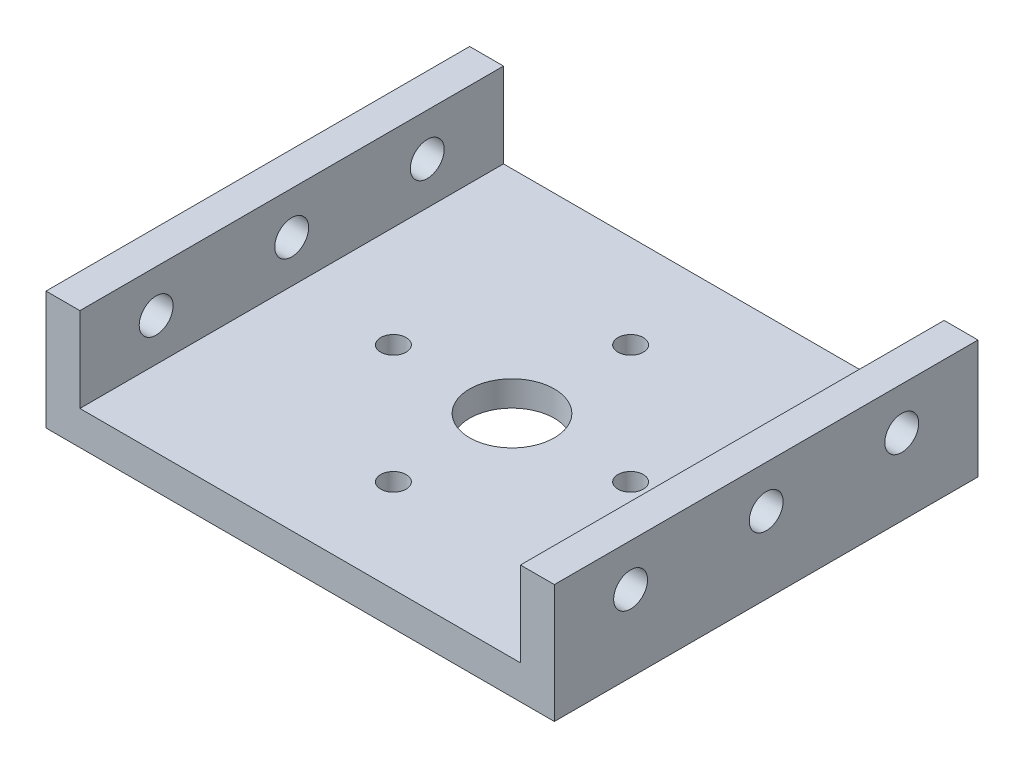
ISO-10303-21;
HEADER;
FILE_DESCRIPTION(('STEP AP214'),'2;1');
FILE_NAME('part.step','',(''),(''),'','','');
FILE_SCHEMA(('AUTOMOTIVE_DESIGN { 1 0 10303 214 1 1 1 1 }'));
ENDSEC;
DATA;
#1=APPLICATION_CONTEXT('core data for automotive mechanical design processes');
#2=APPLICATION_PROTOCOL_DEFINITION('international standard','automotive_design',2000,#1);
#3=PRODUCT_CONTEXT('',#1,'mechanical');
#4=PRODUCT('Part','Part','',(#3));
#5=PRODUCT_RELATED_PRODUCT_CATEGORY('part','',(#4));
#6=PRODUCT_DEFINITION_FORMATION('','',#4);
#7=PRODUCT_DEFINITION_CONTEXT('part definition',#1,'design');
#8=PRODUCT_DEFINITION('design','',#6,#7);
#9=PRODUCT_DEFINITION_SHAPE('','',#8);
#10=(LENGTH_UNIT() NAMED_UNIT(*) SI_UNIT(.MILLI.,.METRE.));
#11=(NAMED_UNIT(*) PLANE_ANGLE_UNIT() SI_UNIT($,.RADIAN.));
#12=(NAMED_UNIT(*) SI_UNIT($,.STERADIAN.) SOLID_ANGLE_UNIT());
#13=UNCERTAINTY_MEASURE_WITH_UNIT(LENGTH_MEASURE(1.E-05),#10,'distance_accuracy_value','');
#14=(GEOMETRIC_REPRESENTATION_CONTEXT(3) GLOBAL_UNCERTAINTY_ASSIGNED_CONTEXT((#13)) GLOBAL_UNIT_ASSIGNED_CONTEXT((#10,
#11,#12)) REPRESENTATION_CONTEXT('',''));
#15=CARTESIAN_POINT('',(0.,0.,0.));
#16=DIRECTION('',(0.,0.,1.));
#17=DIRECTION('',(1.,0.,0.));
#18=AXIS2_PLACEMENT_3D('',#15,#16,#17);
#19=CARTESIAN_POINT('',(0.,-14.142135623731,0.));
#20=DIRECTION('',(0.,1.,0.));
#21=DIRECTION('',(0.,0.,1.));
#22=AXIS2_PLACEMENT_3D('',#19,#20,#21);
#23=CYLINDRICAL_SURFACE('',#22,5.);
#24=CARTESIAN_POINT('',(0.,3.99999999999999,0.));
#25=DIRECTION('',(0.,1.,0.));
#26=DIRECTION('',(0.,0.,1.));
#27=AXIS2_PLACEMENT_3D('',#24,#25,#26);
#28=CIRCLE('',#27,5.);
#29=CARTESIAN_POINT('',(0.,3.99999999999999,5.));
#30=VERTEX_POINT('',#29);
#31=EDGE_CURVE('E149',#30,#30,#28,.T.);
#32=CARTESIAN_POINT('',(0.,0.999999999999999,0.));
#33=DIRECTION('',(0.,-1.,0.));
#34=DIRECTION('',(1.,0.,0.));
#35=AXIS2_PLACEMENT_3D('',#32,#33,#34);
#36=CIRCLE('',#35,5.);
#37=CARTESIAN_POINT('',(0.,1.,5.));
#38=VERTEX_POINT('',#37);
#39=EDGE_CURVE('E510',#38,#38,#36,.F.);
#40=CARTESIAN_POINT('',(0.,3.99999999999999,5.));
#41=CARTESIAN_POINT('',(0.,3.96874999999999,5.));
#42=CARTESIAN_POINT('',(0.,3.93749999999999,5.));
#43=CARTESIAN_POINT('',(0.,3.87499999999999,5.));
#44=CARTESIAN_POINT('',(0.,3.84374999999999,5.));
#45=CARTESIAN_POINT('',(0.,3.78124999999999,5.));
#46=CARTESIAN_POINT('',(0.,3.74999999999999,5.));
#47=CARTESIAN_POINT('',(0.,3.68749999999999,5.));
#48=CARTESIAN_POINT('',(0.,3.65624999999999,5.));
#49=CARTESIAN_POINT('',(0.,3.59374999999999,5.));
#50=CARTESIAN_POINT('',(0.,3.56249999999999,5.));
#51=CARTESIAN_POINT('',(0.,3.49999999999999,5.));
#52=CARTESIAN_POINT('',(0.,3.46874999999999,5.));
#53=CARTESIAN_POINT('',(0.,3.40624999999999,5.));
#54=CARTESIAN_POINT('',(0.,3.37499999999999,5.));
#55=CARTESIAN_POINT('',(0.,3.31249999999999,5.));
#56=CARTESIAN_POINT('',(0.,3.28124999999999,5.));
#57=CARTESIAN_POINT('',(0.,3.21874999999999,5.));
#58=CARTESIAN_POINT('',(0.,3.18749999999999,5.));
#59=CARTESIAN_POINT('',(0.,3.12499999999999,5.));
#60=CARTESIAN_POINT('',(0.,3.09374999999999,5.));
#61=CARTESIAN_POINT('',(0.,3.03124999999999,5.));
#62=CARTESIAN_POINT('',(0.,2.99999999999999,5.));
#63=CARTESIAN_POINT('',(0.,2.93749999999999,5.));
#64=CARTESIAN_POINT('',(0.,2.90624999999999,5.));
#65=CARTESIAN_POINT('',(0.,2.84374999999999,5.));
#66=CARTESIAN_POINT('',(0.,2.81249999999999,5.));
#67=CARTESIAN_POINT('',(0.,2.74999999999999,5.));
#68=CARTESIAN_POINT('',(0.,2.71874999999999,5.));
#69=CARTESIAN_POINT('',(0.,2.65624999999999,5.));
#70=CARTESIAN_POINT('',(0.,2.62499999999999,5.));
#71=CARTESIAN_POINT('',(0.,2.5625,5.));
#72=CARTESIAN_POINT('',(0.,2.53125,5.));
#73=CARTESIAN_POINT('',(0.,2.46875,5.));
#74=CARTESIAN_POINT('',(0.,2.4375,5.));
#75=CARTESIAN_POINT('',(0.,2.375,5.));
#76=CARTESIAN_POINT('',(0.,2.34375,5.));
#77=CARTESIAN_POINT('',(0.,2.28125,5.));
#78=CARTESIAN_POINT('',(0.,2.25,5.));
#79=CARTESIAN_POINT('',(0.,2.1875,5.));
#80=CARTESIAN_POINT('',(0.,2.15625,5.));
#81=CARTESIAN_POINT('',(0.,2.09375,5.));
#82=CARTESIAN_POINT('',(0.,2.0625,5.));
#83=CARTESIAN_POINT('',(0.,2.,5.));
#84=CARTESIAN_POINT('',(0.,1.96875,5.));
#85=CARTESIAN_POINT('',(0.,1.90625,5.));
#86=CARTESIAN_POINT('',(0.,1.875,5.));
#87=CARTESIAN_POINT('',(0.,1.8125,5.));
#88=CARTESIAN_POINT('',(0.,1.78125,5.));
#89=CARTESIAN_POINT('',(0.,1.71875,5.));
#90=CARTESIAN_POINT('',(0.,1.6875,5.));
#91=CARTESIAN_POINT('',(0.,1.625,5.));
#92=CARTESIAN_POINT('',(0.,1.59375,5.));
#93=CARTESIAN_POINT('',(0.,1.53125,5.));
#94=CARTESIAN_POINT('',(0.,1.5,5.));
#95=CARTESIAN_POINT('',(0.,1.4375,5.));
#96=CARTESIAN_POINT('',(0.,1.40625,5.));
#97=CARTESIAN_POINT('',(0.,1.34375,5.));
#98=CARTESIAN_POINT('',(0.,1.3125,5.));
#99=CARTESIAN_POINT('',(0.,1.25,5.));
#100=CARTESIAN_POINT('',(0.,1.21875,5.));
#101=CARTESIAN_POINT('',(0.,1.15625,5.));
#102=CARTESIAN_POINT('',(0.,1.125,5.));
#103=CARTESIAN_POINT('',(0.,1.0625,5.));
#104=CARTESIAN_POINT('',(0.,1.03125,5.));
#105=CARTESIAN_POINT('',(0.,1.,5.));
#106=B_SPLINE_CURVE_WITH_KNOTS('',3,(#40,#41,#42,#43,#44,#45,#46,#47,#48,#49,#50,#51,#52,#53,
#54,#55,#56,#57,#58,#59,#60,#61,#62,#63,#64,#65,#66,#67,#68,#69,#70,#71,#72,#73,#74,#75,#76,#77,
#78,#79,#80,#81,#82,#83,#84,#85,#86,#87,#88,#89,#90,#91,#92,#93,#94,#95,#96,#97,#98,#99,#100,
#101,#102,#103,#104,#105),.UNSPECIFIED.,.F.,.F.,(4,2,2,2,2,2,2,2,2,2,2,2,2,2,2,2,2,2,2,2,2,2,2,
2,2,2,2,2,2,2,2,2,4),(0.,0.0937500000000001,0.1875,0.28125,0.375,0.46875,0.562499999999997,
0.656249999999997,0.749999999999997,0.843749999999997,0.937499999999997,1.03125,1.125,1.21875,
1.3125,1.40625,1.49999999999999,1.59374999999999,1.68749999999999,1.78124999999999,
1.87499999999999,1.96874999999999,2.06249999999999,2.15625,2.25,2.34375,2.4375,2.53124999999999,
2.62499999999999,2.71874999999999,2.81249999999999,2.90624999999999,2.99999999999999),.UNSPECIFIED.);
#107=EDGE_CURVE('BSEAM36',#30,#38,#106,.T.);
#108=ORIENTED_EDGE('',*,*,#31,.T.);
#109=ORIENTED_EDGE('',*,*,#39,.F.);
#110=ORIENTED_EDGE('',*,*,#107,.T.);
#111=ORIENTED_EDGE('',*,*,#107,.F.);
#112=EDGE_LOOP('',(#108,#110,#109,#111));
#113=FACE_BOUND('',#112,.T.);
#114=ADVANCED_FACE('F36',(#113),#23,.F.);
#115=CARTESIAN_POINT('',(30.,14.,25.));
#116=DIRECTION('',(0.,-1.,0.));
#117=DIRECTION('',(0.,0.,-1.));
#118=AXIS2_PLACEMENT_3D('',#115,#116,#117);
#119=PLANE('',#118);
#120=DIRECTION('',(-1.,0.,0.));
#121=VECTOR('',#120,1.);
#122=CARTESIAN_POINT('',(30.,14.,-25.));
#123=LINE('',#122,#121);
#124=CARTESIAN_POINT('',(30.,14.,-25.));
#125=VERTEX_POINT('',#124);
#126=CARTESIAN_POINT('',(26.,14.,-25.));
#127=VERTEX_POINT('',#126);
#128=EDGE_CURVE('E145',#125,#127,#123,.T.);
#129=ORIENTED_EDGE('',*,*,#128,.T.);
#130=DIRECTION('',(0.,0.,-1.));
#131=VECTOR('',#130,1.);
#132=CARTESIAN_POINT('',(26.,14.,25.));
#133=LINE('',#132,#131);
#134=CARTESIAN_POINT('',(26.,14.,25.));
#135=VERTEX_POINT('',#134);
#136=EDGE_CURVE('E174',#135,#127,#133,.T.);
#137=ORIENTED_EDGE('',*,*,#136,.F.);
#138=DIRECTION('',(-1.,0.,0.));
#139=VECTOR('',#138,1.);
#140=CARTESIAN_POINT('',(30.,14.,25.));
#141=LINE('',#140,#139);
#142=CARTESIAN_POINT('',(30.,14.,25.));
#143=VERTEX_POINT('',#142);
#144=EDGE_CURVE('E161',#143,#135,#141,.T.);
#145=ORIENTED_EDGE('',*,*,#144,.F.);
#146=DIRECTION('',(0.,0.,-1.));
#147=VECTOR('',#146,1.);
#148=CARTESIAN_POINT('',(30.,14.,25.));
#149=LINE('',#148,#147);
#150=EDGE_CURVE('E141',#143,#125,#149,.T.);
#151=ORIENTED_EDGE('',*,*,#150,.T.);
#152=EDGE_LOOP('',(#129,#137,#145,#151));
#153=FACE_BOUND('',#152,.T.);
#154=ADVANCED_FACE('F38',(#153),#119,.F.);
#155=CARTESIAN_POINT('',(26.,14.,25.));
#156=DIRECTION('',(1.,0.,0.));
#157=DIRECTION('',(0.,1.,0.));
#158=AXIS2_PLACEMENT_3D('',#155,#156,#157);
#159=PLANE('',#158);
#160=CARTESIAN_POINT('',(26.,9.00000000000001,16.));
#161=DIRECTION('',(1.,0.,0.));
#162=DIRECTION('',(0.,1.,0.));
#163=AXIS2_PLACEMENT_3D('',#160,#161,#162);
#164=CIRCLE('',#163,2.);
#165=CARTESIAN_POINT('',(26.,11.,16.));
#166=VERTEX_POINT('',#165);
#167=EDGE_CURVE('E483',#166,#166,#164,.T.);
#168=ORIENTED_EDGE('',*,*,#167,.T.);
#169=EDGE_LOOP('',(#168));
#170=FACE_BOUND('',#169,.T.);
#171=CARTESIAN_POINT('',(26.,9.,0.));
#172=DIRECTION('',(1.,0.,0.));
#173=DIRECTION('',(0.,1.,0.));
#174=AXIS2_PLACEMENT_3D('',#171,#172,#173);
#175=CIRCLE('',#174,2.);
#176=CARTESIAN_POINT('',(26.,11.,0.));
#177=VERTEX_POINT('',#176);
#178=EDGE_CURVE('E484',#177,#177,#175,.T.);
#179=ORIENTED_EDGE('',*,*,#178,.T.);
#180=EDGE_LOOP('',(#179));
#181=FACE_BOUND('',#180,.T.);
#182=CARTESIAN_POINT('',(26.,9.00000000000001,-16.));
#183=DIRECTION('',(1.,0.,0.));
#184=DIRECTION('',(0.,1.,0.));
#185=AXIS2_PLACEMENT_3D('',#182,#183,#184);
#186=CIRCLE('',#185,2.);
#187=CARTESIAN_POINT('',(26.,11.,-16.));
#188=VERTEX_POINT('',#187);
#189=EDGE_CURVE('E595',#188,#188,#186,.T.);
#190=ORIENTED_EDGE('',*,*,#189,.T.);
#191=EDGE_LOOP('',(#190));
#192=FACE_BOUND('',#191,.T.);
#193=DIRECTION('',(0.,-1.,0.));
#194=VECTOR('',#193,1.);
#195=CARTESIAN_POINT('',(26.,14.,-25.));
#196=LINE('',#195,#194);
#197=CARTESIAN_POINT('',(26.,4.,-25.));
#198=VERTEX_POINT('',#197);
#199=EDGE_CURVE('E148',#127,#198,#196,.T.);
#200=ORIENTED_EDGE('',*,*,#199,.T.);
#201=DIRECTION('',(0.,0.,-1.));
#202=VECTOR('',#201,1.);
#203=CARTESIAN_POINT('',(26.,4.,25.));
#204=LINE('',#203,#202);
#205=CARTESIAN_POINT('',(26.,4.,25.));
#206=VERTEX_POINT('',#205);
#207=EDGE_CURVE('E171',#206,#198,#204,.T.);
#208=ORIENTED_EDGE('',*,*,#207,.F.);
#209=DIRECTION('',(0.,-1.,0.));
#210=VECTOR('',#209,1.);
#211=CARTESIAN_POINT('',(26.,14.,25.));
#212=LINE('',#211,#210);
#213=EDGE_CURVE('E102',#135,#206,#212,.T.);
#214=ORIENTED_EDGE('',*,*,#213,.F.);
#215=ORIENTED_EDGE('',*,*,#136,.T.);
#216=EDGE_LOOP('',(#200,#208,#214,#215));
#217=FACE_BOUND('',#216,.T.);
#218=ADVANCED_FACE('F237',(#170,#181,#192,#217),#159,.F.);
#219=CARTESIAN_POINT('',(-26.,3.99999999999999,25.));
#220=DIRECTION('',(0.,-1.,0.));
#221=DIRECTION('',(1.,0.,0.));
#222=AXIS2_PLACEMENT_3D('',#219,#220,#221);
#223=PLANE('',#222);
#224=CARTESIAN_POINT('',(0.,3.99999999999999,-14.));
#225=DIRECTION('',(0.,1.,0.));
#226=DIRECTION('',(0.,0.,1.));
#227=AXIS2_PLACEMENT_3D('',#224,#225,#226);
#228=CIRCLE('',#227,1.5);
#229=CARTESIAN_POINT('',(0.,3.99999999999999,-12.5));
#230=VERTEX_POINT('',#229);
#231=EDGE_CURVE('E200',#230,#230,#228,.T.);
#232=ORIENTED_EDGE('',*,*,#231,.F.);
#233=EDGE_LOOP('',(#232));
#234=FACE_BOUND('',#233,.T.);
#235=CARTESIAN_POINT('',(14.0000000000007,3.99999999999999,-7.05276754523767E-13));
#236=DIRECTION('',(0.,1.,0.));
#237=DIRECTION('',(0.,0.,1.));
#238=AXIS2_PLACEMENT_3D('',#235,#236,#237);
#239=CIRCLE('',#238,1.5);
#240=CARTESIAN_POINT('',(14.0000000000007,3.99999999999999,1.49999999999929));
#241=VERTEX_POINT('',#240);
#242=EDGE_CURVE('E209',#241,#241,#239,.T.);
#243=ORIENTED_EDGE('',*,*,#242,.F.);
#244=EDGE_LOOP('',(#243));
#245=FACE_BOUND('',#244,.T.);
#246=CARTESIAN_POINT('',(1.41008646811169E-12,3.99999999999999,14.));
#247=DIRECTION('',(0.,1.,0.));
#248=DIRECTION('',(0.,0.,1.));
#249=AXIS2_PLACEMENT_3D('',#246,#247,#248);
#250=CIRCLE('',#249,1.5);
#251=CARTESIAN_POINT('',(1.41008646811169E-12,3.99999999999999,15.5));
#252=VERTEX_POINT('',#251);
#253=EDGE_CURVE('E532',#252,#252,#250,.T.);
#254=ORIENTED_EDGE('',*,*,#253,.F.);
#255=EDGE_LOOP('',(#254));
#256=FACE_BOUND('',#255,.T.);
#257=CARTESIAN_POINT('',(-13.9999999999993,3.99999999999999,7.06991260042573E-13));
#258=DIRECTION('',(0.,1.,0.));
#259=DIRECTION('',(0.,0.,1.));
#260=AXIS2_PLACEMENT_3D('',#257,#258,#259);
#261=CIRCLE('',#260,1.5);
#262=CARTESIAN_POINT('',(-13.9999999999993,3.99999999999999,1.50000000000071));
#263=VERTEX_POINT('',#262);
#264=EDGE_CURVE('E531',#263,#263,#261,.T.);
#265=ORIENTED_EDGE('',*,*,#264,.F.);
#266=EDGE_LOOP('',(#265));
#267=FACE_BOUND('',#266,.T.);
#268=ORIENTED_EDGE('',*,*,#31,.F.);
#269=EDGE_LOOP('',(#268));
#270=FACE_BOUND('',#269,.T.);
#271=DIRECTION('',(-1.,0.,0.));
#272=VECTOR('',#271,1.);
#273=CARTESIAN_POINT('',(-26.,3.99999999999999,-25.));
#274=LINE('',#273,#272);
#275=CARTESIAN_POINT('',(-26.,3.99999999999999,-25.));
#276=VERTEX_POINT('',#275);
#277=EDGE_CURVE('E151',#198,#276,#274,.T.);
#278=ORIENTED_EDGE('',*,*,#277,.T.);
#279=DIRECTION('',(0.,0.,-1.));
#280=VECTOR('',#279,1.);
#281=CARTESIAN_POINT('',(-26.,3.99999999999999,25.));
#282=LINE('',#281,#280);
#283=CARTESIAN_POINT('',(-26.,3.99999999999999,25.));
#284=VERTEX_POINT('',#283);
#285=EDGE_CURVE('E168',#284,#276,#282,.T.);
#286=ORIENTED_EDGE('',*,*,#285,.F.);
#287=DIRECTION('',(-1.,0.,0.));
#288=VECTOR('',#287,1.);
#289=CARTESIAN_POINT('',(-26.,3.99999999999999,25.));
#290=LINE('',#289,#288);
#291=EDGE_CURVE('E217',#206,#284,#290,.T.);
#292=ORIENTED_EDGE('',*,*,#291,.F.);
#293=ORIENTED_EDGE('',*,*,#207,.T.);
#294=EDGE_LOOP('',(#278,#286,#292,#293));
#295=FACE_BOUND('',#294,.T.);
#296=ADVANCED_FACE('F240',(#234,#245,#256,#267,#270,#295),#223,.F.);
#297=CARTESIAN_POINT('',(-26.,14.,25.));
#298=DIRECTION('',(-1.,0.,0.));
#299=DIRECTION('',(0.,0.,1.));
#300=AXIS2_PLACEMENT_3D('',#297,#298,#299);
#301=PLANE('',#300);
#302=CARTESIAN_POINT('',(-26.,9.00000000000001,16.));
#303=DIRECTION('',(-1.,0.,0.));
#304=DIRECTION('',(0.,0.,1.));
#305=AXIS2_PLACEMENT_3D('',#302,#303,#304);
#306=CIRCLE('',#305,2.);
#307=CARTESIAN_POINT('',(-26.,9.00000000000001,18.));
#308=VERTEX_POINT('',#307);
#309=EDGE_CURVE('E482',#308,#308,#306,.T.);
#310=ORIENTED_EDGE('',*,*,#309,.T.);
#311=EDGE_LOOP('',(#310));
#312=FACE_BOUND('',#311,.T.);
#313=CARTESIAN_POINT('',(-26.,9.,0.));
#314=DIRECTION('',(-1.,0.,0.));
#315=DIRECTION('',(0.,0.,1.));
#316=AXIS2_PLACEMENT_3D('',#313,#314,#315);
#317=CIRCLE('',#316,2.);
#318=CARTESIAN_POINT('',(-26.,9.,2.));
#319=VERTEX_POINT('',#318);
#320=EDGE_CURVE('E489',#319,#319,#317,.T.);
#321=ORIENTED_EDGE('',*,*,#320,.T.);
#322=EDGE_LOOP('',(#321));
#323=FACE_BOUND('',#322,.T.);
#324=CARTESIAN_POINT('',(-26.,9.00000000000001,-16.));
#325=DIRECTION('',(-1.,0.,0.));
#326=DIRECTION('',(0.,0.,1.));
#327=AXIS2_PLACEMENT_3D('',#324,#325,#326);
#328=CIRCLE('',#327,2.);
#329=CARTESIAN_POINT('',(-26.,9.00000000000001,-14.));
#330=VERTEX_POINT('',#329);
#331=EDGE_CURVE('E598',#330,#330,#328,.T.);
#332=ORIENTED_EDGE('',*,*,#331,.T.);
#333=EDGE_LOOP('',(#332));
#334=FACE_BOUND('',#333,.T.);
#335=DIRECTION('',(0.,1.,0.));
#336=VECTOR('',#335,1.);
#337=CARTESIAN_POINT('',(-26.,14.,-25.));
#338=LINE('',#337,#336);
#339=CARTESIAN_POINT('',(-26.,14.,-25.));
#340=VERTEX_POINT('',#339);
#341=EDGE_CURVE('E153',#276,#340,#338,.T.);
#342=ORIENTED_EDGE('',*,*,#341,.T.);
#343=DIRECTION('',(0.,0.,-1.));
#344=VECTOR('',#343,1.);
#345=CARTESIAN_POINT('',(-26.,14.,25.));
#346=LINE('',#345,#344);
#347=CARTESIAN_POINT('',(-26.,14.,25.));
#348=VERTEX_POINT('',#347);
#349=EDGE_CURVE('E165',#348,#340,#346,.T.);
#350=ORIENTED_EDGE('',*,*,#349,.F.);
#351=DIRECTION('',(0.,1.,0.));
#352=VECTOR('',#351,1.);
#353=CARTESIAN_POINT('',(-26.,14.,25.));
#354=LINE('',#353,#352);
#355=EDGE_CURVE('E219',#284,#348,#354,.T.);
#356=ORIENTED_EDGE('',*,*,#355,.F.);
#357=ORIENTED_EDGE('',*,*,#285,.T.);
#358=EDGE_LOOP('',(#342,#350,#356,#357));
#359=FACE_BOUND('',#358,.T.);
#360=ADVANCED_FACE('F225',(#312,#323,#334,#359),#301,.F.);
#361=CARTESIAN_POINT('',(-30.,14.,25.));
#362=DIRECTION('',(0.,-1.,0.));
#363=DIRECTION('',(0.,0.,-1.));
#364=AXIS2_PLACEMENT_3D('',#361,#362,#363);
#365=PLANE('',#364);
#366=DIRECTION('',(-1.,0.,0.));
#367=VECTOR('',#366,1.);
#368=CARTESIAN_POINT('',(-30.,14.,-25.));
#369=LINE('',#368,#367);
#370=CARTESIAN_POINT('',(-30.,14.,-25.));
#371=VERTEX_POINT('',#370);
#372=EDGE_CURVE('E155',#340,#371,#369,.T.);
#373=ORIENTED_EDGE('',*,*,#372,.T.);
#374=DIRECTION('',(0.,0.,-1.));
#375=VECTOR('',#374,1.);
#376=CARTESIAN_POINT('',(-30.,14.,25.));
#377=LINE('',#376,#375);
#378=CARTESIAN_POINT('',(-30.,14.,25.));
#379=VERTEX_POINT('',#378);
#380=EDGE_CURVE('E136',#379,#371,#377,.T.);
#381=ORIENTED_EDGE('',*,*,#380,.F.);
#382=DIRECTION('',(-1.,0.,0.));
#383=VECTOR('',#382,1.);
#384=CARTESIAN_POINT('',(-30.,14.,25.));
#385=LINE('',#384,#383);
#386=EDGE_CURVE('E124',#348,#379,#385,.T.);
#387=ORIENTED_EDGE('',*,*,#386,.F.);
#388=ORIENTED_EDGE('',*,*,#349,.T.);
#389=EDGE_LOOP('',(#373,#381,#387,#388));
#390=FACE_BOUND('',#389,.T.);
#391=ADVANCED_FACE('F229',(#390),#365,.F.);
#392=CARTESIAN_POINT('',(-30.,0.,25.));
#393=DIRECTION('',(1.,0.,0.));
#394=DIRECTION('',(0.,0.,-1.));
#395=AXIS2_PLACEMENT_3D('',#392,#393,#394);
#396=PLANE('',#395);
#397=CARTESIAN_POINT('',(-30.,9.00000000000001,16.));
#398=DIRECTION('',(1.,0.,0.));
#399=DIRECTION('',(0.,0.,-1.));
#400=AXIS2_PLACEMENT_3D('',#397,#398,#399);
#401=CIRCLE('',#400,2.);
#402=CARTESIAN_POINT('',(-30.,9.00000000000001,14.));
#403=VERTEX_POINT('',#402);
#404=EDGE_CURVE('E479',#403,#403,#401,.T.);
#405=ORIENTED_EDGE('',*,*,#404,.T.);
#406=EDGE_LOOP('',(#405));
#407=FACE_BOUND('',#406,.T.);
#408=CARTESIAN_POINT('',(-30.,9.,0.));
#409=DIRECTION('',(1.,0.,0.));
#410=DIRECTION('',(0.,0.,-1.));
#411=AXIS2_PLACEMENT_3D('',#408,#409,#410);
#412=CIRCLE('',#411,2.);
#413=CARTESIAN_POINT('',(-30.,9.,-2.));
#414=VERTEX_POINT('',#413);
#415=EDGE_CURVE('E610',#414,#414,#412,.T.);
#416=ORIENTED_EDGE('',*,*,#415,.T.);
#417=EDGE_LOOP('',(#416));
#418=FACE_BOUND('',#417,.T.);
#419=CARTESIAN_POINT('',(-30.,9.00000000000001,-16.));
#420=DIRECTION('',(1.,0.,0.));
#421=DIRECTION('',(0.,0.,-1.));
#422=AXIS2_PLACEMENT_3D('',#419,#420,#421);
#423=CIRCLE('',#422,2.);
#424=CARTESIAN_POINT('',(-30.,9.00000000000001,-18.));
#425=VERTEX_POINT('',#424);
#426=EDGE_CURVE('E604',#425,#425,#423,.T.);
#427=ORIENTED_EDGE('',*,*,#426,.T.);
#428=EDGE_LOOP('',(#427));
#429=FACE_BOUND('',#428,.T.);
#430=DIRECTION('',(0.,-1.,0.));
#431=VECTOR('',#430,1.);
#432=CARTESIAN_POINT('',(-30.,0.,-25.));
#433=LINE('',#432,#431);
#434=CARTESIAN_POINT('',(-30.,0.,-25.));
#435=VERTEX_POINT('',#434);
#436=EDGE_CURVE('E133',#371,#435,#433,.T.);
#437=ORIENTED_EDGE('',*,*,#436,.T.);
#438=DIRECTION('',(0.,0.,-1.));
#439=VECTOR('',#438,1.);
#440=CARTESIAN_POINT('',(-30.,0.,25.));
#441=LINE('',#440,#439);
#442=CARTESIAN_POINT('',(-30.,0.,25.));
#443=VERTEX_POINT('',#442);
#444=EDGE_CURVE('E130',#443,#435,#441,.T.);
#445=ORIENTED_EDGE('',*,*,#444,.F.);
#446=DIRECTION('',(0.,-1.,0.));
#447=VECTOR('',#446,1.);
#448=CARTESIAN_POINT('',(-30.,0.,25.));
#449=LINE('',#448,#447);
#450=EDGE_CURVE('E117',#379,#443,#449,.T.);
#451=ORIENTED_EDGE('',*,*,#450,.F.);
#452=ORIENTED_EDGE('',*,*,#380,.T.);
#453=EDGE_LOOP('',(#437,#445,#451,#452));
#454=FACE_BOUND('',#453,.T.);
#455=ADVANCED_FACE('F131',(#407,#418,#429,#454),#396,.F.);
#456=CARTESIAN_POINT('',(30.,0.,25.));
#457=DIRECTION('',(0.,1.,0.));
#458=DIRECTION('',(-1.,0.,0.));
#459=AXIS2_PLACEMENT_3D('',#456,#457,#458);
#460=PLANE('',#459);
#461=CARTESIAN_POINT('',(-13.9999999999993,0.,7.06991260042573E-13));
#462=DIRECTION('',(0.,1.,0.));
#463=DIRECTION('',(-1.,0.,0.));
#464=AXIS2_PLACEMENT_3D('',#461,#462,#463);
#465=CIRCLE('',#464,1.5);
#466=CARTESIAN_POINT('',(-13.9196428571428,0.,1.49784603000245));
#467=VERTEX_POINT('',#466);
#468=CARTESIAN_POINT('',(-13.9196428571429,0.,-1.49784603000104));
#469=VERTEX_POINT('',#468);
#470=EDGE_CURVE('E535',#467,#469,#465,.F.);
#471=ORIENTED_EDGE('',*,*,#470,.F.);
#472=CARTESIAN_POINT('',(0.,0.,0.));
#473=DIRECTION('',(0.,-1.,0.));
#474=DIRECTION('',(1.,0.,0.));
#475=AXIS2_PLACEMENT_3D('',#472,#473,#474);
#476=CIRCLE('',#475,14.);
#477=CARTESIAN_POINT('',(-1.49784603000029,0.,13.919642857143));
#478=VERTEX_POINT('',#477);
#479=EDGE_CURVE('E502',#478,#467,#476,.T.);
#480=ORIENTED_EDGE('',*,*,#479,.F.);
#481=CARTESIAN_POINT('',(1.41008646811169E-12,0.,14.));
#482=DIRECTION('',(0.,1.,0.));
#483=DIRECTION('',(-1.,0.,0.));
#484=AXIS2_PLACEMENT_3D('',#481,#482,#483);
#485=CIRCLE('',#484,1.5);
#486=CARTESIAN_POINT('',(1.4978460300031,0.,13.9196428571427));
#487=VERTEX_POINT('',#486);
#488=EDGE_CURVE('E212',#487,#478,#485,.F.);
#489=ORIENTED_EDGE('',*,*,#488,.F.);
#490=CARTESIAN_POINT('',(13.9196428571429,0.,1.49784603000094));
#491=VERTEX_POINT('',#490);
#492=EDGE_CURVE('E499',#491,#487,#476,.T.);
#493=ORIENTED_EDGE('',*,*,#492,.F.);
#494=CARTESIAN_POINT('',(14.0000000000007,0.,-7.05276754523767E-13));
#495=DIRECTION('',(0.,1.,0.));
#496=DIRECTION('',(-1.,0.,0.));
#497=AXIS2_PLACEMENT_3D('',#494,#495,#496);
#498=CIRCLE('',#497,1.5);
#499=CARTESIAN_POINT('',(13.9196428571428,0.,-1.49784603000234));
#500=VERTEX_POINT('',#499);
#501=EDGE_CURVE('E205',#500,#491,#498,.F.);
#502=ORIENTED_EDGE('',*,*,#501,.F.);
#503=CARTESIAN_POINT('',(1.4978460300017,0.,-13.9196428571429));
#504=VERTEX_POINT('',#503);
#505=EDGE_CURVE('E199',#504,#500,#476,.T.);
#506=ORIENTED_EDGE('',*,*,#505,.F.);
#507=CARTESIAN_POINT('',(0.,0.,-14.));
#508=DIRECTION('',(0.,1.,0.));
#509=DIRECTION('',(-1.,0.,0.));
#510=AXIS2_PLACEMENT_3D('',#507,#508,#509);
#511=CIRCLE('',#510,1.5);
#512=CARTESIAN_POINT('',(-1.4978460300017,0.,-13.9196428571429));
#513=VERTEX_POINT('',#512);
#514=EDGE_CURVE('E186',#513,#504,#511,.F.);
#515=ORIENTED_EDGE('',*,*,#514,.F.);
#516=EDGE_CURVE('E195',#469,#513,#476,.T.);
#517=ORIENTED_EDGE('',*,*,#516,.F.);
#518=EDGE_LOOP('',(#471,#480,#489,#493,#502,#506,#515,#517));
#519=FACE_BOUND('',#518,.T.);
#520=DIRECTION('',(1.,0.,0.));
#521=VECTOR('',#520,1.);
#522=CARTESIAN_POINT('',(30.,0.,-25.));
#523=LINE('',#522,#521);
#524=CARTESIAN_POINT('',(30.,0.,-25.));
#525=VERTEX_POINT('',#524);
#526=EDGE_CURVE('E158',#435,#525,#523,.T.);
#527=ORIENTED_EDGE('',*,*,#526,.T.);
#528=DIRECTION('',(0.,0.,-1.));
#529=VECTOR('',#528,1.);
#530=CARTESIAN_POINT('',(30.,0.,25.));
#531=LINE('',#530,#529);
#532=CARTESIAN_POINT('',(30.,0.,25.));
#533=VERTEX_POINT('',#532);
#534=EDGE_CURVE('E137',#533,#525,#531,.T.);
#535=ORIENTED_EDGE('',*,*,#534,.F.);
#536=DIRECTION('',(1.,0.,0.));
#537=VECTOR('',#536,1.);
#538=CARTESIAN_POINT('',(30.,0.,25.));
#539=LINE('',#538,#537);
#540=EDGE_CURVE('E121',#443,#533,#539,.T.);
#541=ORIENTED_EDGE('',*,*,#540,.F.);
#542=ORIENTED_EDGE('',*,*,#444,.T.);
#543=EDGE_LOOP('',(#527,#535,#541,#542));
#544=FACE_BOUND('',#543,.T.);
#545=ADVANCED_FACE('F139',(#519,#544),#460,.F.);
#546=CARTESIAN_POINT('',(30.,0.,25.));
#547=DIRECTION('',(-1.,0.,0.));
#548=DIRECTION('',(0.,-1.,0.));
#549=AXIS2_PLACEMENT_3D('',#546,#547,#548);
#550=PLANE('',#549);
#551=CARTESIAN_POINT('',(30.,9.00000000000001,16.));
#552=DIRECTION('',(1.,0.,0.));
#553=DIRECTION('',(0.,0.,-1.));
#554=AXIS2_PLACEMENT_3D('',#551,#552,#553);
#555=CIRCLE('',#554,2.);
#556=CARTESIAN_POINT('',(30.,9.00000000000001,14.));
#557=VERTEX_POINT('',#556);
#558=EDGE_CURVE('E613',#557,#557,#555,.T.);
#559=ORIENTED_EDGE('',*,*,#558,.F.);
#560=EDGE_LOOP('',(#559));
#561=FACE_BOUND('',#560,.T.);
#562=CARTESIAN_POINT('',(30.,9.,0.));
#563=DIRECTION('',(1.,0.,0.));
#564=DIRECTION('',(0.,0.,-1.));
#565=AXIS2_PLACEMENT_3D('',#562,#563,#564);
#566=CIRCLE('',#565,2.);
#567=CARTESIAN_POINT('',(30.,9.,-2.));
#568=VERTEX_POINT('',#567);
#569=EDGE_CURVE('E607',#568,#568,#566,.T.);
#570=ORIENTED_EDGE('',*,*,#569,.F.);
#571=EDGE_LOOP('',(#570));
#572=FACE_BOUND('',#571,.T.);
#573=CARTESIAN_POINT('',(30.,9.00000000000001,-16.));
#574=DIRECTION('',(1.,0.,0.));
#575=DIRECTION('',(0.,0.,-1.));
#576=AXIS2_PLACEMENT_3D('',#573,#574,#575);
#577=CIRCLE('',#576,2.);
#578=CARTESIAN_POINT('',(30.,9.00000000000001,-18.));
#579=VERTEX_POINT('',#578);
#580=EDGE_CURVE('E601',#579,#579,#577,.T.);
#581=ORIENTED_EDGE('',*,*,#580,.F.);
#582=EDGE_LOOP('',(#581));
#583=FACE_BOUND('',#582,.T.);
#584=DIRECTION('',(0.,1.,0.));
#585=VECTOR('',#584,1.);
#586=CARTESIAN_POINT('',(30.,0.,-25.));
#587=LINE('',#586,#585);
#588=EDGE_CURVE('E93',#525,#125,#587,.T.);
#589=ORIENTED_EDGE('',*,*,#588,.T.);
#590=ORIENTED_EDGE('',*,*,#150,.F.);
#591=DIRECTION('',(0.,1.,0.));
#592=VECTOR('',#591,1.);
#593=CARTESIAN_POINT('',(30.,0.,25.));
#594=LINE('',#593,#592);
#595=EDGE_CURVE('E60',#533,#143,#594,.T.);
#596=ORIENTED_EDGE('',*,*,#595,.F.);
#597=ORIENTED_EDGE('',*,*,#534,.T.);
#598=EDGE_LOOP('',(#589,#590,#596,#597));
#599=FACE_BOUND('',#598,.T.);
#600=ADVANCED_FACE('F233',(#561,#572,#583,#599),#550,.F.);
#601=CARTESIAN_POINT('',(0.,0.,25.));
#602=DIRECTION('',(0.,0.,1.));
#603=DIRECTION('',(1.,0.,0.));
#604=AXIS2_PLACEMENT_3D('',#601,#602,#603);
#605=PLANE('',#604);
#606=ORIENTED_EDGE('',*,*,#144,.T.);
#607=ORIENTED_EDGE('',*,*,#213,.T.);
#608=ORIENTED_EDGE('',*,*,#291,.T.);
#609=ORIENTED_EDGE('',*,*,#355,.T.);
#610=ORIENTED_EDGE('',*,*,#386,.T.);
#611=ORIENTED_EDGE('',*,*,#450,.T.);
#612=ORIENTED_EDGE('',*,*,#540,.T.);
#613=ORIENTED_EDGE('',*,*,#595,.T.);
#614=EDGE_LOOP('',(#606,#607,#608,#609,#610,#611,#612,#613));
#615=FACE_BOUND('',#614,.T.);
#616=ADVANCED_FACE('F119',(#615),#605,.T.);
#617=CARTESIAN_POINT('',(0.,0.,-25.));
#618=DIRECTION('',(0.,0.,1.));
#619=DIRECTION('',(1.,0.,0.));
#620=AXIS2_PLACEMENT_3D('',#617,#618,#619);
#621=PLANE('',#620);
#622=ORIENTED_EDGE('',*,*,#128,.F.);
#623=ORIENTED_EDGE('',*,*,#588,.F.);
#624=ORIENTED_EDGE('',*,*,#526,.F.);
#625=ORIENTED_EDGE('',*,*,#436,.F.);
#626=ORIENTED_EDGE('',*,*,#372,.F.);
#627=ORIENTED_EDGE('',*,*,#341,.F.);
#628=ORIENTED_EDGE('',*,*,#277,.F.);
#629=ORIENTED_EDGE('',*,*,#199,.F.);
#630=EDGE_LOOP('',(#622,#623,#624,#625,#626,#627,#628,#629));
#631=FACE_BOUND('',#630,.T.);
#632=ADVANCED_FACE('F232',(#631),#621,.F.);
#633=CARTESIAN_POINT('',(-13.9999999999993,-14.142135623731,7.06991260042573E-13));
#634=DIRECTION('',(0.,1.,0.));
#635=DIRECTION('',(0.,0.,1.));
#636=AXIS2_PLACEMENT_3D('',#633,#634,#635);
#637=CYLINDRICAL_SURFACE('',#636,1.5);
#638=ORIENTED_EDGE('',*,*,#470,.T.);
#639=DIRECTION('',(0.,-1.,0.));
#640=VECTOR('',#639,1.);
#641=CARTESIAN_POINT('',(-13.9196428571429,0.499999999999998,-1.49784603000103));
#642=LINE('',#641,#640);
#643=CARTESIAN_POINT('',(-13.9196428571429,0.999999999999997,-1.49784603000104));
#644=VERTEX_POINT('',#643);
#645=EDGE_CURVE('E528',#469,#644,#642,.F.);
#646=ORIENTED_EDGE('',*,*,#645,.T.);
#647=CARTESIAN_POINT('',(-13.9999999999993,0.999999999999997,7.06991260042573E-13));
#648=DIRECTION('',(0.,-1.,0.));
#649=DIRECTION('',(1.,0.,0.));
#650=AXIS2_PLACEMENT_3D('',#647,#648,#649);
#651=CIRCLE('',#650,1.5);
#652=CARTESIAN_POINT('',(-13.9196428571428,0.999999999999997,1.49784603000245));
#653=VERTEX_POINT('',#652);
#654=EDGE_CURVE('E508',#653,#644,#651,.F.);
#655=ORIENTED_EDGE('',*,*,#654,.F.);
#656=DIRECTION('',(0.,-1.,0.));
#657=VECTOR('',#656,1.);
#658=CARTESIAN_POINT('',(-13.9196428571428,0.499999999999998,1.49784603000243));
#659=LINE('',#658,#657);
#660=EDGE_CURVE('E525',#653,#467,#659,.T.);
#661=ORIENTED_EDGE('',*,*,#660,.T.);
#662=EDGE_LOOP('',(#638,#646,#655,#661));
#663=FACE_BOUND('',#662,.T.);
#664=ORIENTED_EDGE('',*,*,#264,.T.);
#665=EDGE_LOOP('',(#664));
#666=FACE_BOUND('',#665,.T.);
#667=ADVANCED_FACE('F268',(#663,#666),#637,.F.);
#668=CARTESIAN_POINT('',(1.41008646811169E-12,-14.142135623731,14.));
#669=DIRECTION('',(0.,1.,0.));
#670=DIRECTION('',(0.,0.,1.));
#671=AXIS2_PLACEMENT_3D('',#668,#669,#670);
#672=CYLINDRICAL_SURFACE('',#671,1.5);
#673=ORIENTED_EDGE('',*,*,#488,.T.);
#674=DIRECTION('',(0.,-1.,0.));
#675=VECTOR('',#674,1.);
#676=CARTESIAN_POINT('',(-1.49784603000029,0.5,13.919642857143));
#677=LINE('',#676,#675);
#678=CARTESIAN_POINT('',(-1.49784603000029,0.999999999999999,13.919642857143));
#679=VERTEX_POINT('',#678);
#680=EDGE_CURVE('E522',#478,#679,#677,.F.);
#681=ORIENTED_EDGE('',*,*,#680,.T.);
#682=CARTESIAN_POINT('',(1.41008646811169E-12,0.999999999999999,14.));
#683=DIRECTION('',(0.,-1.,0.));
#684=DIRECTION('',(1.,0.,0.));
#685=AXIS2_PLACEMENT_3D('',#682,#683,#684);
#686=CIRCLE('',#685,1.5);
#687=CARTESIAN_POINT('',(1.4978460300031,0.999999999999999,13.9196428571427));
#688=VERTEX_POINT('',#687);
#689=EDGE_CURVE('E505',#688,#679,#686,.F.);
#690=ORIENTED_EDGE('',*,*,#689,.F.);
#691=DIRECTION('',(0.,-1.,0.));
#692=VECTOR('',#691,1.);
#693=CARTESIAN_POINT('',(1.4978460300031,0.5,13.9196428571427));
#694=LINE('',#693,#692);
#695=EDGE_CURVE('E519',#688,#487,#694,.T.);
#696=ORIENTED_EDGE('',*,*,#695,.T.);
#697=EDGE_LOOP('',(#673,#681,#690,#696));
#698=FACE_BOUND('',#697,.T.);
#699=ORIENTED_EDGE('',*,*,#253,.T.);
#700=EDGE_LOOP('',(#699));
#701=FACE_BOUND('',#700,.T.);
#702=ADVANCED_FACE('F310',(#698,#701),#672,.F.);
#703=CARTESIAN_POINT('',(14.0000000000007,-14.142135623731,-7.05276754523767E-13));
#704=DIRECTION('',(0.,1.,0.));
#705=DIRECTION('',(0.,0.,1.));
#706=AXIS2_PLACEMENT_3D('',#703,#704,#705);
#707=CYLINDRICAL_SURFACE('',#706,1.5);
#708=ORIENTED_EDGE('',*,*,#501,.T.);
#709=DIRECTION('',(0.,-1.,0.));
#710=VECTOR('',#709,1.);
#711=CARTESIAN_POINT('',(13.9196428571429,0.500000000000002,1.49784603000095));
#712=LINE('',#711,#710);
#713=CARTESIAN_POINT('',(13.9196428571429,1.,1.49784603000094));
#714=VERTEX_POINT('',#713);
#715=EDGE_CURVE('E516',#491,#714,#712,.F.);
#716=ORIENTED_EDGE('',*,*,#715,.T.);
#717=CARTESIAN_POINT('',(14.0000000000007,1.,-7.05276754523767E-13));
#718=DIRECTION('',(0.,-1.,0.));
#719=DIRECTION('',(1.,0.,0.));
#720=AXIS2_PLACEMENT_3D('',#717,#718,#719);
#721=CIRCLE('',#720,1.5);
#722=CARTESIAN_POINT('',(13.9196428571428,1.,-1.49784603000234));
#723=VERTEX_POINT('',#722);
#724=EDGE_CURVE('E496',#723,#714,#721,.F.);
#725=ORIENTED_EDGE('',*,*,#724,.F.);
#726=DIRECTION('',(0.,-1.,0.));
#727=VECTOR('',#726,1.);
#728=CARTESIAN_POINT('',(13.9196428571428,0.500000000000002,-1.49784603000236));
#729=LINE('',#728,#727);
#730=EDGE_CURVE('E513',#723,#500,#729,.T.);
#731=ORIENTED_EDGE('',*,*,#730,.T.);
#732=EDGE_LOOP('',(#708,#716,#725,#731));
#733=FACE_BOUND('',#732,.T.);
#734=ORIENTED_EDGE('',*,*,#242,.T.);
#735=EDGE_LOOP('',(#734));
#736=FACE_BOUND('',#735,.T.);
#737=ADVANCED_FACE('F262',(#733,#736),#707,.F.);
#738=CARTESIAN_POINT('',(0.,-14.142135623731,-14.));
#739=DIRECTION('',(0.,1.,0.));
#740=DIRECTION('',(0.,0.,1.));
#741=AXIS2_PLACEMENT_3D('',#738,#739,#740);
#742=CYLINDRICAL_SURFACE('',#741,1.5);
#743=ORIENTED_EDGE('',*,*,#514,.T.);
#744=DIRECTION('',(0.,-1.,0.));
#745=VECTOR('',#744,1.);
#746=CARTESIAN_POINT('',(1.49784603000169,0.5,-13.9196428571429));
#747=LINE('',#746,#745);
#748=CARTESIAN_POINT('',(1.4978460300017,0.999999999999999,-13.9196428571429));
#749=VERTEX_POINT('',#748);
#750=EDGE_CURVE('E11',#504,#749,#747,.F.);
#751=ORIENTED_EDGE('',*,*,#750,.T.);
#752=CARTESIAN_POINT('',(0.,0.999999999999999,-14.));
#753=DIRECTION('',(0.,-1.,0.));
#754=DIRECTION('',(1.,0.,0.));
#755=AXIS2_PLACEMENT_3D('',#752,#753,#754);
#756=CIRCLE('',#755,1.5);
#757=CARTESIAN_POINT('',(-1.4978460300017,0.999999999999999,-13.9196428571429));
#758=VERTEX_POINT('',#757);
#759=EDGE_CURVE('E176',#758,#749,#756,.F.);
#760=ORIENTED_EDGE('',*,*,#759,.F.);
#761=DIRECTION('',(0.,-1.,0.));
#762=VECTOR('',#761,1.);
#763=CARTESIAN_POINT('',(-1.49784603000169,0.5,-13.9196428571429));
#764=LINE('',#763,#762);
#765=EDGE_CURVE('E44',#758,#513,#764,.T.);
#766=ORIENTED_EDGE('',*,*,#765,.T.);
#767=EDGE_LOOP('',(#743,#751,#760,#766));
#768=FACE_BOUND('',#767,.T.);
#769=ORIENTED_EDGE('',*,*,#231,.T.);
#770=EDGE_LOOP('',(#769));
#771=FACE_BOUND('',#770,.T.);
#772=ADVANCED_FACE('F183',(#768,#771),#742,.F.);
#773=CARTESIAN_POINT('',(0.,1.,0.));
#774=DIRECTION('',(0.,-1.,0.));
#775=DIRECTION('',(1.,0.,0.));
#776=AXIS2_PLACEMENT_3D('',#773,#774,#775);
#777=CYLINDRICAL_SURFACE('',#776,14.);
#778=ORIENTED_EDGE('',*,*,#516,.T.);
#779=ORIENTED_EDGE('',*,*,#765,.F.);
#780=CARTESIAN_POINT('',(0.,1.,0.));
#781=DIRECTION('',(0.,-1.,0.));
#782=DIRECTION('',(1.,0.,0.));
#783=AXIS2_PLACEMENT_3D('',#780,#781,#782);
#784=CIRCLE('',#783,14.);
#785=EDGE_CURVE('E51',#644,#758,#784,.T.);
#786=ORIENTED_EDGE('',*,*,#785,.F.);
#787=ORIENTED_EDGE('',*,*,#645,.F.);
#788=EDGE_LOOP('',(#778,#779,#786,#787));
#789=FACE_BOUND('',#788,.T.);
#790=ADVANCED_FACE('F331',(#789),#777,.F.);
#791=EDGE_CURVE('E497',#679,#653,#784,.T.);
#792=ORIENTED_EDGE('',*,*,#791,.F.);
#793=ORIENTED_EDGE('',*,*,#680,.F.);
#794=ORIENTED_EDGE('',*,*,#479,.T.);
#795=ORIENTED_EDGE('',*,*,#660,.F.);
#796=EDGE_LOOP('',(#792,#793,#794,#795));
#797=FACE_BOUND('',#796,.T.);
#798=ADVANCED_FACE('F337',(#797),#777,.F.);
#799=EDGE_CURVE('E493',#714,#688,#784,.T.);
#800=ORIENTED_EDGE('',*,*,#799,.F.);
#801=ORIENTED_EDGE('',*,*,#715,.F.);
#802=ORIENTED_EDGE('',*,*,#492,.T.);
#803=ORIENTED_EDGE('',*,*,#695,.F.);
#804=EDGE_LOOP('',(#800,#801,#802,#803));
#805=FACE_BOUND('',#804,.T.);
#806=ADVANCED_FACE('F345',(#805),#777,.F.);
#807=EDGE_CURVE('E498',#749,#723,#784,.T.);
#808=ORIENTED_EDGE('',*,*,#807,.F.);
#809=ORIENTED_EDGE('',*,*,#750,.F.);
#810=ORIENTED_EDGE('',*,*,#505,.T.);
#811=ORIENTED_EDGE('',*,*,#730,.F.);
#812=EDGE_LOOP('',(#808,#809,#810,#811));
#813=FACE_BOUND('',#812,.T.);
#814=ADVANCED_FACE('F339',(#813),#777,.F.);
#815=CARTESIAN_POINT('',(0.,1.,0.));
#816=DIRECTION('',(0.,-1.,0.));
#817=DIRECTION('',(1.,0.,0.));
#818=AXIS2_PLACEMENT_3D('',#815,#816,#817);
#819=PLANE('',#818);
#820=ORIENTED_EDGE('',*,*,#654,.T.);
#821=ORIENTED_EDGE('',*,*,#785,.T.);
#822=ORIENTED_EDGE('',*,*,#759,.T.);
#823=ORIENTED_EDGE('',*,*,#807,.T.);
#824=ORIENTED_EDGE('',*,*,#724,.T.);
#825=ORIENTED_EDGE('',*,*,#799,.T.);
#826=ORIENTED_EDGE('',*,*,#689,.T.);
#827=ORIENTED_EDGE('',*,*,#791,.T.);
#828=EDGE_LOOP('',(#820,#821,#822,#823,#824,#825,#826,#827));
#829=FACE_BOUND('',#828,.T.);
#830=ORIENTED_EDGE('',*,*,#39,.T.);
#831=EDGE_LOOP('',(#830));
#832=FACE_BOUND('',#831,.T.);
#833=ADVANCED_FACE('F358',(#829,#832),#819,.T.);
#834=CARTESIAN_POINT('',(-30.,9.00000000000001,-16.));
#835=DIRECTION('',(1.,0.,0.));
#836=DIRECTION('',(0.,0.,-1.));
#837=AXIS2_PLACEMENT_3D('',#834,#835,#836);
#838=CYLINDRICAL_SURFACE('',#837,2.);
#839=ORIENTED_EDGE('',*,*,#580,.T.);
#840=EDGE_LOOP('',(#839));
#841=FACE_BOUND('',#840,.T.);
#842=ORIENTED_EDGE('',*,*,#189,.F.);
#843=EDGE_LOOP('',(#842));
#844=FACE_BOUND('',#843,.T.);
#845=ADVANCED_FACE('F365',(#841,#844),#838,.F.);
#846=CARTESIAN_POINT('',(-30.,9.,0.));
#847=DIRECTION('',(1.,0.,0.));
#848=DIRECTION('',(0.,0.,-1.));
#849=AXIS2_PLACEMENT_3D('',#846,#847,#848);
#850=CYLINDRICAL_SURFACE('',#849,2.);
#851=ORIENTED_EDGE('',*,*,#569,.T.);
#852=EDGE_LOOP('',(#851));
#853=FACE_BOUND('',#852,.T.);
#854=ORIENTED_EDGE('',*,*,#178,.F.);
#855=EDGE_LOOP('',(#854));
#856=FACE_BOUND('',#855,.T.);
#857=ADVANCED_FACE('F372',(#853,#856),#850,.F.);
#858=CARTESIAN_POINT('',(-30.,9.00000000000001,16.));
#859=DIRECTION('',(1.,0.,0.));
#860=DIRECTION('',(0.,0.,-1.));
#861=AXIS2_PLACEMENT_3D('',#858,#859,#860);
#862=CYLINDRICAL_SURFACE('',#861,2.);
#863=ORIENTED_EDGE('',*,*,#558,.T.);
#864=EDGE_LOOP('',(#863));
#865=FACE_BOUND('',#864,.T.);
#866=ORIENTED_EDGE('',*,*,#167,.F.);
#867=EDGE_LOOP('',(#866));
#868=FACE_BOUND('',#867,.T.);
#869=ADVANCED_FACE('F381',(#865,#868),#862,.F.);
#870=ORIENTED_EDGE('',*,*,#426,.F.);
#871=EDGE_LOOP('',(#870));
#872=FACE_BOUND('',#871,.T.);
#873=ORIENTED_EDGE('',*,*,#331,.F.);
#874=EDGE_LOOP('',(#873));
#875=FACE_BOUND('',#874,.T.);
#876=ADVANCED_FACE('F375',(#872,#875),#838,.F.);
#877=ORIENTED_EDGE('',*,*,#415,.F.);
#878=EDGE_LOOP('',(#877));
#879=FACE_BOUND('',#878,.T.);
#880=ORIENTED_EDGE('',*,*,#320,.F.);
#881=EDGE_LOOP('',(#880));
#882=FACE_BOUND('',#881,.T.);
#883=ADVANCED_FACE('F384',(#879,#882),#850,.F.);
#884=ORIENTED_EDGE('',*,*,#404,.F.);
#885=EDGE_LOOP('',(#884));
#886=FACE_BOUND('',#885,.T.);
#887=ORIENTED_EDGE('',*,*,#309,.F.);
#888=EDGE_LOOP('',(#887));
#889=FACE_BOUND('',#888,.T.);
#890=ADVANCED_FACE('F392',(#886,#889),#862,.F.);
#891=CLOSED_SHELL('',(#114,#154,#218,#296,#360,#391,#455,#545,#600,#616,#632,#667,#702,#737,
#772,#790,#798,#806,#814,#833,#845,#857,#869,#876,#883,#890));
#892=MANIFOLD_SOLID_BREP('B2',#891);
#893=ADVANCED_BREP_SHAPE_REPRESENTATION('',(#18,#892),#14);
#894=SHAPE_DEFINITION_REPRESENTATION(#9,#893);
ENDSEC;
END-ISO-10303-21;
